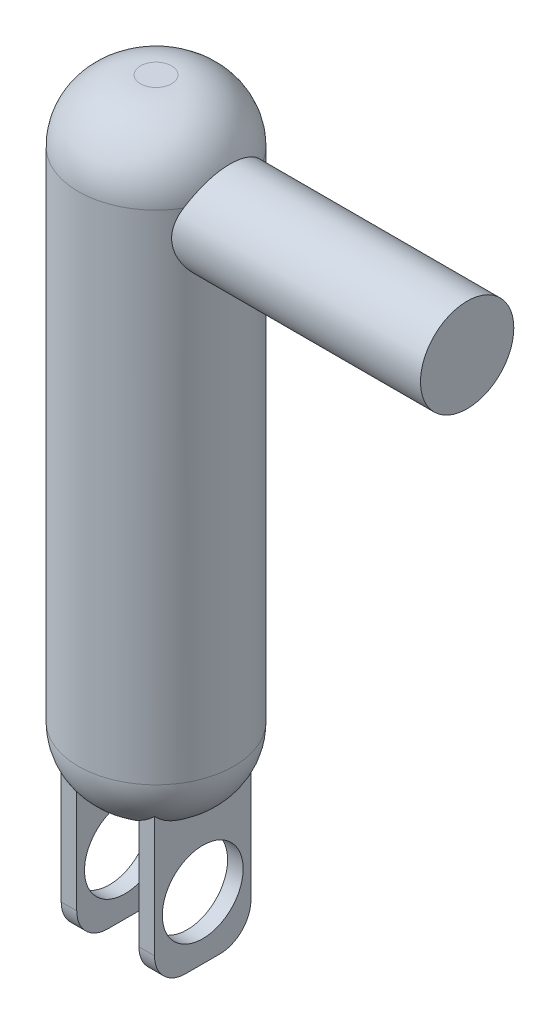
ISO-10303-21;
HEADER;
FILE_DESCRIPTION(('STEP AP214'),'2;1');
FILE_NAME('part.step','',(''),(''),'','','');
FILE_SCHEMA(('AUTOMOTIVE_DESIGN { 1 0 10303 214 1 1 1 1 }'));
ENDSEC;
DATA;
#1=APPLICATION_CONTEXT('core data for automotive mechanical design processes');
#2=APPLICATION_PROTOCOL_DEFINITION('international standard','automotive_design',2000,#1);
#3=PRODUCT_CONTEXT('',#1,'mechanical');
#4=PRODUCT('Part','Part','',(#3));
#5=PRODUCT_RELATED_PRODUCT_CATEGORY('part','',(#4));
#6=PRODUCT_DEFINITION_FORMATION('','',#4);
#7=PRODUCT_DEFINITION_CONTEXT('part definition',#1,'design');
#8=PRODUCT_DEFINITION('design','',#6,#7);
#9=PRODUCT_DEFINITION_SHAPE('','',#8);
#10=(LENGTH_UNIT() NAMED_UNIT(*) SI_UNIT(.MILLI.,.METRE.));
#11=(NAMED_UNIT(*) PLANE_ANGLE_UNIT() SI_UNIT($,.RADIAN.));
#12=(NAMED_UNIT(*) SI_UNIT($,.STERADIAN.) SOLID_ANGLE_UNIT());
#13=UNCERTAINTY_MEASURE_WITH_UNIT(LENGTH_MEASURE(1.E-05),#10,'distance_accuracy_value','');
#14=(GEOMETRIC_REPRESENTATION_CONTEXT(3) GLOBAL_UNCERTAINTY_ASSIGNED_CONTEXT((#13)) GLOBAL_UNIT_ASSIGNED_CONTEXT((#10,
#11,#12)) REPRESENTATION_CONTEXT('',''));
#15=CARTESIAN_POINT('',(0.,0.,0.));
#16=DIRECTION('',(0.,0.,1.));
#17=DIRECTION('',(1.,0.,0.));
#18=AXIS2_PLACEMENT_3D('',#15,#16,#17);
#19=CARTESIAN_POINT('',(0.,-4.,0.));
#20=DIRECTION('',(0.,1.,0.));
#21=DIRECTION('',(0.,0.,1.));
#22=AXIS2_PLACEMENT_3D('',#19,#20,#21);
#23=PLANE('',#22);
#24=DIRECTION('',(0.,0.,-1.));
#25=VECTOR('',#24,1.);
#26=CARTESIAN_POINT('',(-1.5,-4.,1.54960128164039));
#27=LINE('',#26,#25);
#28=CARTESIAN_POINT('',(-1.5,-4.,0.549601281640391));
#29=VERTEX_POINT('',#28);
#30=CARTESIAN_POINT('',(-1.5,-4.,-0.549601281640391));
#31=VERTEX_POINT('',#30);
#32=EDGE_CURVE('E121',#29,#31,#27,.T.);
#33=ORIENTED_EDGE('',*,*,#32,.T.);
#34=DIRECTION('',(1.,0.,0.));
#35=VECTOR('',#34,1.);
#36=CARTESIAN_POINT('',(0.,-4.,-0.549601281640391));
#37=LINE('',#36,#35);
#38=CARTESIAN_POINT('',(-1.,-4.,-0.549601281640391));
#39=VERTEX_POINT('',#38);
#40=EDGE_CURVE('E220',#31,#39,#37,.T.);
#41=ORIENTED_EDGE('',*,*,#40,.T.);
#42=DIRECTION('',(0.,0.,-1.));
#43=VECTOR('',#42,1.);
#44=CARTESIAN_POINT('',(-1.,-4.,1.04960128164039));
#45=LINE('',#44,#43);
#46=CARTESIAN_POINT('',(-1.,-4.,0.549601281640391));
#47=VERTEX_POINT('',#46);
#48=EDGE_CURVE('E384',#47,#39,#45,.T.);
#49=ORIENTED_EDGE('',*,*,#48,.F.);
#50=DIRECTION('',(-1.,0.,0.));
#51=VECTOR('',#50,1.);
#52=CARTESIAN_POINT('',(0.,-4.,0.549601281640391));
#53=LINE('',#52,#51);
#54=EDGE_CURVE('E224',#47,#29,#53,.T.);
#55=ORIENTED_EDGE('',*,*,#54,.T.);
#56=EDGE_LOOP('',(#33,#41,#49,#55));
#57=FACE_BOUND('',#56,.T.);
#58=ADVANCED_FACE('F42',(#57),#23,.F.);
#59=CARTESIAN_POINT('',(1.5,-4.,-1.54960128164039));
#60=DIRECTION('',(0.,0.,1.));
#61=DIRECTION('',(1.,0.,0.));
#62=AXIS2_PLACEMENT_3D('',#59,#60,#61);
#63=PLANE('',#62);
#64=DIRECTION('',(0.,-1.,0.));
#65=VECTOR('',#64,1.);
#66=CARTESIAN_POINT('',(-1.,-4.,-1.54960128164039));
#67=LINE('',#66,#65);
#68=CARTESIAN_POINT('',(-1.,0.519126098050792,-1.54960128164039));
#69=VERTEX_POINT('',#68);
#70=CARTESIAN_POINT('',(-1.,-3.,-1.54960128164039));
#71=VERTEX_POINT('',#70);
#72=EDGE_CURVE('E181',#69,#71,#67,.T.);
#73=ORIENTED_EDGE('',*,*,#72,.T.);
#74=DIRECTION('',(1.,0.,0.));
#75=VECTOR('',#74,1.);
#76=CARTESIAN_POINT('',(1.5,-3.,-1.54960128164039));
#77=LINE('',#76,#75);
#78=CARTESIAN_POINT('',(-1.5,-3.,-1.54960128164039));
#79=VERTEX_POINT('',#78);
#80=EDGE_CURVE('E255',#71,#79,#77,.F.);
#81=ORIENTED_EDGE('',*,*,#80,.T.);
#82=DIRECTION('',(0.,1.,0.));
#83=VECTOR('',#82,1.);
#84=CARTESIAN_POINT('',(-1.5,-4.,-1.54960128164039));
#85=LINE('',#84,#83);
#86=CARTESIAN_POINT('',(-1.5,0.879547043866674,-1.54960128164039));
#87=VERTEX_POINT('',#86);
#88=EDGE_CURVE('E393',#79,#87,#85,.T.);
#89=ORIENTED_EDGE('',*,*,#88,.T.);
#90=CARTESIAN_POINT('',(-1.5,0.879547043866674,-1.54960128164039));
#91=CARTESIAN_POINT('',(-1.4638808582443,0.842390503172263,-1.54960128164039));
#92=CARTESIAN_POINT('',(-1.42606648884728,0.806900844992077,-1.54960128164039));
#93=CARTESIAN_POINT('',(-1.34773043366033,0.739650750616816,-1.54960128164039));
#94=CARTESIAN_POINT('',(-1.30723044033096,0.707865067196324,-1.54960128164039));
#95=CARTESIAN_POINT('',(-1.22367967102287,0.647881223598541,-1.54960128164039));
#96=CARTESIAN_POINT('',(-1.1806295372897,0.619682165722839,-1.54960128164039));
#97=CARTESIAN_POINT('',(-1.09203210493764,0.566722867871002,-1.54960128164039));
#98=CARTESIAN_POINT('',(-1.04646882271296,0.541989333895669,-1.54960128164039));
#99=CARTESIAN_POINT('',(-1.,0.519126098050791,-1.54960128164039));
#100=B_SPLINE_CURVE_WITH_KNOTS('',3,(#90,#91,#92,#93,#94,#95,#96,#97,#98,#99),.UNSPECIFIED.,.F.,
.F.,(4,2,2,2,4),(0.,0.155383386332783,0.309636578684485,0.463851086627952,0.61919536083452),.UNSPECIFIED.);
#101=EDGE_CURVE('E129',#87,#69,#100,.T.);
#102=ORIENTED_EDGE('',*,*,#101,.T.);
#103=EDGE_LOOP('',(#73,#81,#89,#102));
#104=FACE_BOUND('',#103,.T.);
#105=ADVANCED_FACE('F160',(#104),#63,.F.);
#106=CARTESIAN_POINT('',(1.5,-4.,1.54960128164039));
#107=DIRECTION('',(0.,0.,-1.));
#108=DIRECTION('',(-1.,0.,0.));
#109=AXIS2_PLACEMENT_3D('',#106,#107,#108);
#110=PLANE('',#109);
#111=DIRECTION('',(0.,1.,0.));
#112=VECTOR('',#111,1.);
#113=CARTESIAN_POINT('',(-1.5,-4.,1.54960128164039));
#114=LINE('',#113,#112);
#115=CARTESIAN_POINT('',(-1.5,-3.,1.54960128164039));
#116=VERTEX_POINT('',#115);
#117=CARTESIAN_POINT('',(-1.5,0.879547043866674,1.54960128164039));
#118=VERTEX_POINT('',#117);
#119=EDGE_CURVE('E110',#116,#118,#114,.T.);
#120=ORIENTED_EDGE('',*,*,#119,.F.);
#121=DIRECTION('',(-1.,0.,0.));
#122=VECTOR('',#121,1.);
#123=CARTESIAN_POINT('',(1.5,-3.,1.54960128164039));
#124=LINE('',#123,#122);
#125=CARTESIAN_POINT('',(-1.,-3.,1.54960128164039));
#126=VERTEX_POINT('',#125);
#127=EDGE_CURVE('E290',#116,#126,#124,.F.);
#128=ORIENTED_EDGE('',*,*,#127,.T.);
#129=DIRECTION('',(0.,1.,0.));
#130=VECTOR('',#129,1.);
#131=CARTESIAN_POINT('',(-1.,-4.,1.54960128164039));
#132=LINE('',#131,#130);
#133=CARTESIAN_POINT('',(-1.,0.519126098050792,1.54960128164039));
#134=VERTEX_POINT('',#133);
#135=EDGE_CURVE('E374',#126,#134,#132,.T.);
#136=ORIENTED_EDGE('',*,*,#135,.T.);
#137=CARTESIAN_POINT('',(-1.,0.519126098050792,1.54960128164039));
#138=CARTESIAN_POINT('',(-1.04042658820715,0.53902605194962,1.54960128164039));
#139=CARTESIAN_POINT('',(-1.08014913363178,0.560317558514565,1.54960128164039));
#140=CARTESIAN_POINT('',(-1.15799718747282,0.60571175048767,1.54960128164039));
#141=CARTESIAN_POINT('',(-1.19612132461254,0.62981678516088,1.54960128164039));
#142=CARTESIAN_POINT('',(-1.3066719118082,0.705627611504845,1.54960128164039));
#143=CARTESIAN_POINT('',(-1.37641921861021,0.761386360676856,1.54960128164039));
#144=CARTESIAN_POINT('',(-1.46139594686397,0.840786061158543,1.54960128164039));
#145=CARTESIAN_POINT('',(-1.48094055162411,0.859939105412498,1.54960128164039));
#146=CARTESIAN_POINT('',(-1.50000000000001,0.879547043866665,1.54960128164039));
#147=B_SPLINE_CURVE_WITH_KNOTS('',3,(#137,#138,#139,#140,#141,#142,#143,#144,#145,#146),
.UNSPECIFIED.,.F.,.F.,(4,2,2,2,4),(0.,0.135111250664872,0.270336135865954,0.537006119326535,
0.619066123124216),.UNSPECIFIED.);
#148=EDGE_CURVE('E122',#134,#118,#147,.T.);
#149=ORIENTED_EDGE('',*,*,#148,.T.);
#150=EDGE_LOOP('',(#120,#128,#136,#149));
#151=FACE_BOUND('',#150,.T.);
#152=ADVANCED_FACE('F210',(#151),#110,.F.);
#153=CARTESIAN_POINT('',(0.,20.,0.));
#154=DIRECTION('',(0.,-1.,0.));
#155=DIRECTION('',(0.,0.,-1.));
#156=AXIS2_PLACEMENT_3D('',#153,#154,#155);
#157=CYLINDRICAL_SURFACE('',#156,2.5);
#158=CARTESIAN_POINT('',(0.,2.,0.));
#159=DIRECTION('',(0.,1.,0.));
#160=DIRECTION('',(0.,0.,1.));
#161=AXIS2_PLACEMENT_3D('',#158,#159,#160);
#162=CIRCLE('',#161,2.5);
#163=CARTESIAN_POINT('',(0.,2.,2.5));
#164=VERTEX_POINT('',#163);
#165=EDGE_CURVE('E59',#164,#164,#162,.T.);
#166=ORIENTED_EDGE('',*,*,#165,.T.);
#167=EDGE_LOOP('',(#166));
#168=FACE_BOUND('',#167,.T.);
#169=CARTESIAN_POINT('',(2.,17.2021054669246,1.5));
#170=CARTESIAN_POINT('',(1.99999416642511,17.1266264916349,1.50000404108592));
#171=CARTESIAN_POINT('',(2.00433633903481,17.0511670328448,1.49426852824014));
#172=CARTESIAN_POINT('',(2.02092590613883,16.9027815629623,1.47174965152787));
#173=CARTESIAN_POINT('',(2.03318155043097,16.8298582795395,1.45495475788936));
#174=CARTESIAN_POINT('',(2.0636233903473,16.6890218252473,1.41143486335795));
#175=CARTESIAN_POINT('',(2.08176666183119,16.6210766288893,1.3847815450315));
#176=CARTESIAN_POINT('',(2.12185904995836,16.4906680135566,1.32252909283019));
#177=CARTESIAN_POINT('',(2.14380930122416,16.4282062372294,1.28692729054693));
#178=CARTESIAN_POINT('',(2.19228594587542,16.3021564502605,1.20271292747644));
#179=CARTESIAN_POINT('',(2.21904371037662,16.2393645098006,1.15304179435289));
#180=CARTESIAN_POINT('',(2.27226229431061,16.1223407041828,1.04426801309985));
#181=CARTESIAN_POINT('',(2.29872287517103,16.0681153152537,0.985158296729612));
#182=CARTESIAN_POINT('',(2.35175567858734,15.9639716572149,0.851442367411701));
#183=CARTESIAN_POINT('',(2.37803133577818,15.9151510032548,0.775851995162547));
#184=CARTESIAN_POINT('',(2.42443786983179,15.8312957444801,0.615654228271658));
#185=CARTESIAN_POINT('',(2.44457437988735,15.7962484928018,0.531055196626331));
#186=CARTESIAN_POINT('',(2.4747098780044,15.7445095441119,0.363771406742667));
#187=CARTESIAN_POINT('',(2.4854930393917,15.7263851059573,0.281674698130916));
#188=CARTESIAN_POINT('',(2.49874939277545,15.7041626640614,0.114970509382709));
#189=CARTESIAN_POINT('',(2.50123038813308,15.7000514889245,0.0303654624001537));
#190=CARTESIAN_POINT('',(2.49783372711539,15.705719214267,-0.127637283737309));
#191=CARTESIAN_POINT('',(2.49295437513726,15.7138389930939,-0.201123832865634));
#192=CARTESIAN_POINT('',(2.47707997553857,15.7405852625727,-0.345464269151767));
#193=CARTESIAN_POINT('',(2.46608447529309,15.7592125308317,-0.416317961051201));
#194=CARTESIAN_POINT('',(2.43884907201719,15.8062710296283,-0.55405678046908));
#195=CARTESIAN_POINT('',(2.42257910450824,15.8347585280635,-0.620916491037618));
#196=CARTESIAN_POINT('',(2.38609637638748,15.9004900831501,-0.748988660115611));
#197=CARTESIAN_POINT('',(2.36588259201812,15.9377364139836,-0.810199646208011));
#198=CARTESIAN_POINT('',(2.32037925976363,16.024944559729,-0.933074267143199));
#199=CARTESIAN_POINT('',(2.2947718295215,16.0758937786603,-0.993918663198193));
#200=CARTESIAN_POINT('',(2.24255554245601,16.1865095847847,-1.10671465909275));
#201=CARTESIAN_POINT('',(2.21594536703375,16.2461879703991,-1.1586540130834));
#202=CARTESIAN_POINT('',(2.16111075123946,16.3807588730881,-1.25824837767417));
#203=CARTESIAN_POINT('',(2.13305661385124,16.456613043464,-1.30470933188632));
#204=CARTESIAN_POINT('',(2.08250879557267,16.6168116985612,-1.38397217194232));
#205=CARTESIAN_POINT('',(2.06000490298821,16.7011401830502,-1.41679921962189));
#206=CARTESIAN_POINT('',(2.02895865196731,16.8544990988199,-1.46077497064842));
#207=CARTESIAN_POINT('',(2.01833888618316,16.9221460992212,-1.47527903312665));
#208=CARTESIAN_POINT('',(2.00392150777558,17.059479077224,-1.49480872755284));
#209=CARTESIAN_POINT('',(2.00011596115116,17.1291625874091,-1.49984538302907));
#210=CARTESIAN_POINT('',(1.99988914321323,17.2686571493603,-1.50014781114183));
#211=CARTESIAN_POINT('',(2.00347810223984,17.3384682441398,-1.49540004697659));
#212=CARTESIAN_POINT('',(2.01751520788652,17.4760928106731,-1.47640290574941));
#213=CARTESIAN_POINT('',(2.02796877613213,17.5439046591648,-1.4621460183014));
#214=CARTESIAN_POINT('',(2.054317683331,17.6758200464043,-1.42488312618657));
#215=CARTESIAN_POINT('',(2.07020622092812,17.7399281034568,-1.40188805257362));
#216=CARTESIAN_POINT('',(2.10571539417587,17.8635831826547,-1.34796261057072));
#217=CARTESIAN_POINT('',(2.12533743689999,17.9231284732906,-1.31702924888212));
#218=CARTESIAN_POINT('',(2.17036819177737,18.0473455494368,-1.24167439558512));
#219=CARTESIAN_POINT('',(2.19618239397369,18.1110063020211,-1.19582663060303));
#220=CARTESIAN_POINT('',(2.2482175480362,18.230390951774,-1.09487395518701));
#221=CARTESIAN_POINT('',(2.27443886711455,18.2861071590937,-1.03976018672402));
#222=CARTESIAN_POINT('',(2.32835625910913,18.395329474275,-0.91327483721277));
#223=CARTESIAN_POINT('',(2.3558007587587,18.4476061935304,-0.840721108780194));
#224=CARTESIAN_POINT('',(2.40537639133459,18.5390082437612,-0.686103100868022));
#225=CARTESIAN_POINT('',(2.4275110444941,18.5781422947655,-0.604045176134705));
#226=CARTESIAN_POINT('',(2.46252280092775,18.6389736703559,-0.438840232972142));
#227=CARTESIAN_POINT('',(2.47595588067329,18.6617316947157,-0.356205963651261));
#228=CARTESIAN_POINT('',(2.494407389061,18.6928200697708,-0.18738306389086));
#229=CARTESIAN_POINT('',(2.49943534582737,18.7011667576422,-0.101198571781971));
#230=CARTESIAN_POINT('',(2.50040600461976,18.7027800755105,0.0598120232009819));
#231=CARTESIAN_POINT('',(2.49747057186327,18.6979088014876,0.134620583589704));
#232=CARTESIAN_POINT('',(2.48512948412095,18.6772116425429,0.282148755978771));
#233=CARTESIAN_POINT('',(2.47572375706639,18.661385635603,0.354868344701912));
#234=CARTESIAN_POINT('',(2.45149427526962,18.6198858953408,0.495145481978795));
#235=CARTESIAN_POINT('',(2.43675966858906,18.5943738707953,0.562767032608828));
#236=CARTESIAN_POINT('',(2.40303337447155,18.5344648723698,0.692781971999982));
#237=CARTESIAN_POINT('',(2.38404073252268,18.500065906065,0.75517418419983));
#238=CARTESIAN_POINT('',(2.34093432659381,18.4191802703558,0.880263645295945));
#239=CARTESIAN_POINT('',(2.31648844639149,18.3717867579077,0.942258690439938));
#240=CARTESIAN_POINT('',(2.26601907350661,18.2683524332068,1.05789751536306));
#241=CARTESIAN_POINT('',(2.23999385274509,18.2123020413166,1.11153190956915));
#242=CARTESIAN_POINT('',(2.18528165666205,18.0848199047469,1.2159097535057));
#243=CARTESIAN_POINT('',(2.15667566270901,18.0123389807591,1.26542406663367));
#244=CARTESIAN_POINT('',(2.10376464485145,17.858620614158,1.35156817210325));
#245=CARTESIAN_POINT('',(2.07945738811052,17.7773877529431,1.38820466322661));
#246=CARTESIAN_POINT('',(2.0408000304796,17.6150411817874,1.44437116535132));
#247=CARTESIAN_POINT('',(2.02577665830138,17.5345102309633,1.46509526060187));
#248=CARTESIAN_POINT('',(2.00539032320036,17.3700080722209,1.49289268240426));
#249=CARTESIAN_POINT('',(2.00000648744643,17.2860447011658,1.49999550595837));
#250=CARTESIAN_POINT('',(2.,17.2021054669246,1.5));
#251=B_SPLINE_CURVE_WITH_KNOTS('',3,(#169,#170,#171,#172,#173,#174,#175,#176,#177,#178,#179,
#180,#181,#182,#183,#184,#185,#186,#187,#188,#189,#190,#191,#192,#193,#194,#195,#196,#197,#198,
#199,#200,#201,#202,#203,#204,#205,#206,#207,#208,#209,#210,#211,#212,#213,#214,#215,#216,#217,
#218,#219,#220,#221,#222,#223,#224,#225,#226,#227,#228,#229,#230,#231,#232,#233,#234,#235,#236,
#237,#238,#239,#240,#241,#242,#243,#244,#245,#246,#247,#248,#249,#250),.UNSPECIFIED.,.T.,.F.,(4,
2,2,2,2,2,2,2,2,2,2,2,2,2,2,2,2,2,2,2,2,2,2,2,2,2,2,2,2,2,2,2,2,2,2,2,2,2,2,2,4),(0.,
0.226085249493394,0.452406574330771,0.677113624991876,0.90188776221593,1.15414462390001,
1.40659128601844,1.68630157736223,1.9657544327122,2.21853330858497,2.47107452602767,
2.69230130543182,2.91354445887944,3.13607155036377,3.35865648368878,3.60782810055849,
3.85733966656908,4.13576671140276,4.41367760154768,4.62276298054683,4.83160475643976,
5.04073566011181,5.25003193304127,5.45906724365495,5.66818149154661,5.91499438482002,
6.16204457978454,6.44121828011588,6.72020638384847,6.97891479383337,7.23732973022726,
7.46129321849399,7.68525920139648,7.90563970188756,8.12606965394584,8.37042963549487,
8.61506198741955,8.89071695766603,9.16622832484805,9.41820120134353,9.66962780912277),.UNSPECIFIED.);
#252=CARTESIAN_POINT('',(2.15328485944422,18.,1.2701827876681));
#253=VERTEX_POINT('',#252);
#254=CARTESIAN_POINT('',(2.15328485944421,18.,-1.2701827876681));
#255=VERTEX_POINT('',#254);
#256=EDGE_CURVE('E249',#253,#255,#251,.T.);
#257=ORIENTED_EDGE('',*,*,#256,.F.);
#258=CARTESIAN_POINT('',(0.,18.,0.));
#259=DIRECTION('',(0.,1.,0.));
#260=DIRECTION('',(0.,0.,1.));
#261=AXIS2_PLACEMENT_3D('',#258,#259,#260);
#262=CIRCLE('',#261,2.5);
#263=EDGE_CURVE('E300',#253,#255,#262,.F.);
#264=ORIENTED_EDGE('',*,*,#263,.T.);
#265=EDGE_LOOP('',(#257,#264));
#266=FACE_BOUND('',#265,.T.);
#267=ADVANCED_FACE('F333',(#168,#266),#157,.T.);
#268=CARTESIAN_POINT('',(0.,20.,0.));
#269=DIRECTION('',(0.,1.,0.));
#270=DIRECTION('',(0.,0.,1.));
#271=AXIS2_PLACEMENT_3D('',#268,#269,#270);
#272=PLANE('',#271);
#273=CARTESIAN_POINT('',(0.,20.,0.));
#274=DIRECTION('',(0.,1.,0.));
#275=DIRECTION('',(0.,0.,1.));
#276=AXIS2_PLACEMENT_3D('',#273,#274,#275);
#277=CIRCLE('',#276,0.5);
#278=CARTESIAN_POINT('',(0.,20.,0.5));
#279=VERTEX_POINT('',#278);
#280=EDGE_CURVE('E296',#279,#279,#277,.T.);
#281=ORIENTED_EDGE('',*,*,#280,.T.);
#282=EDGE_LOOP('',(#281));
#283=FACE_BOUND('',#282,.T.);
#284=ADVANCED_FACE('F337',(#283),#272,.T.);
#285=CARTESIAN_POINT('',(10.,17.2021054669246,0.));
#286=DIRECTION('',(-1.,0.,0.));
#287=DIRECTION('',(0.,0.,1.));
#288=AXIS2_PLACEMENT_3D('',#285,#286,#287);
#289=CYLINDRICAL_SURFACE('',#288,1.5);
#290=CARTESIAN_POINT('',(10.,17.2021054669246,0.));
#291=DIRECTION('',(1.,0.,0.));
#292=DIRECTION('',(0.,0.,-1.));
#293=AXIS2_PLACEMENT_3D('',#290,#291,#292);
#294=CIRCLE('',#293,1.5);
#295=CARTESIAN_POINT('',(10.,17.2021054669246,-1.5));
#296=VERTEX_POINT('',#295);
#297=EDGE_CURVE('E346',#296,#296,#294,.T.);
#298=ORIENTED_EDGE('',*,*,#297,.F.);
#299=EDGE_LOOP('',(#298));
#300=FACE_BOUND('',#299,.T.);
#301=ORIENTED_EDGE('',*,*,#256,.T.);
#302=CARTESIAN_POINT('',(2.15328485944422,18.,-1.2701827876681));
#303=CARTESIAN_POINT('',(2.16587392853873,18.0339743995266,-1.24884206186948));
#304=CARTESIAN_POINT('',(2.17788511895782,18.0672295514444,-1.22604844473808));
#305=CARTESIAN_POINT('',(2.20076898473468,18.1320457970103,-1.17764532690626));
#306=CARTESIAN_POINT('',(2.21164150031463,18.1636066526141,-1.15203543205912));
#307=CARTESIAN_POINT('',(2.24255496762565,18.2553001849948,-1.0711700052839));
#308=CARTESIAN_POINT('',(2.26091241490787,18.3125003455137,-1.01184345505136));
#309=CARTESIAN_POINT('',(2.2932448745679,18.4168994059381,-0.883808676348255));
#310=CARTESIAN_POINT('',(2.3072135263068,18.4640837582191,-0.815087036637778));
#311=CARTESIAN_POINT('',(2.3309624503762,18.5466147240595,-0.670248840470271));
#312=CARTESIAN_POINT('',(2.3407452220103,18.5819683987193,-0.594136730117599));
#313=CARTESIAN_POINT('',(2.35622187942468,18.6389776011218,-0.438339111543537));
#314=CARTESIAN_POINT('',(2.36199514086901,18.6608979698501,-0.358758236264733));
#315=CARTESIAN_POINT('',(2.36996861653687,18.6914076007743,-0.196883746024653));
#316=CARTESIAN_POINT('',(2.37216797961963,18.6999936873263,-0.11458948961856));
#317=CARTESIAN_POINT('',(2.37307367839003,18.7035133944851,0.0496041482345367));
#318=CARTESIAN_POINT('',(2.37180963599937,18.6985627928392,0.131500914123435));
#319=CARTESIAN_POINT('',(2.36580215584262,18.6754262234782,0.29325565315652));
#320=CARTESIAN_POINT('',(2.36105942754551,18.6572429545372,0.373114038587071));
#321=CARTESIAN_POINT('',(2.34793334601786,18.6082785977509,0.528496491007332));
#322=CARTESIAN_POINT('',(2.33955228859481,18.5775054548953,0.604023257306609));
#323=CARTESIAN_POINT('',(2.31891938779767,18.5044064252262,0.748721227858316));
#324=CARTESIAN_POINT('',(2.30666604616792,18.4620760675845,0.817889958679176));
#325=CARTESIAN_POINT('',(2.27798387832748,18.3670503057562,0.948401476122985));
#326=CARTESIAN_POINT('',(2.26152883176304,18.3142903012027,1.00969134539593));
#327=CARTESIAN_POINT('',(2.22433631553016,18.2004927647196,1.12232303857755));
#328=CARTESIAN_POINT('',(2.20360603926153,18.1394691953374,1.17368129549456));
#329=CARTESIAN_POINT('',(2.17189504376882,18.0506976033489,1.23726598405763));
#330=CARTESIAN_POINT('',(2.16275045066445,18.0255429304402,1.25414664038339));
#331=CARTESIAN_POINT('',(2.15328485944425,18.,1.27018278766813));
#332=B_SPLINE_CURVE_WITH_KNOTS('',3,(#302,#303,#304,#305,#306,#307,#308,#309,#310,#311,#312,
#313,#314,#315,#316,#317,#318,#319,#320,#321,#322,#323,#324,#325,#326,#327,#328,#329,#330,#331),
.UNSPECIFIED.,.F.,.F.,(4,2,2,2,2,2,2,2,2,2,2,2,2,2,4),(0.,0.126078385386652,0.252174438341399,
0.504159961826132,0.756509018642805,1.00870719201915,1.25575822663245,1.50286808899824,
1.7478710749629,1.99282410709121,2.23762279654875,2.48251631918161,2.72897710851837,
2.97502654348348,3.06989011355459),.UNSPECIFIED.);
#333=EDGE_CURVE('E67',#255,#253,#332,.T.);
#334=ORIENTED_EDGE('',*,*,#333,.T.);
#335=EDGE_LOOP('',(#301,#334));
#336=FACE_BOUND('',#335,.T.);
#337=ADVANCED_FACE('F201',(#300,#336),#289,.T.);
#338=CARTESIAN_POINT('',(10.,17.2021054669246,0.));
#339=DIRECTION('',(1.,0.,0.));
#340=DIRECTION('',(0.,0.,-1.));
#341=AXIS2_PLACEMENT_3D('',#338,#339,#340);
#342=PLANE('',#341);
#343=ORIENTED_EDGE('',*,*,#297,.T.);
#344=EDGE_LOOP('',(#343));
#345=FACE_BOUND('',#344,.T.);
#346=ADVANCED_FACE('F192',(#345),#342,.T.);
#347=DIRECTION('',(0.,0.,1.));
#348=VECTOR('',#347,1.);
#349=CARTESIAN_POINT('',(1.,-4.,1.04960128164039));
#350=LINE('',#349,#348);
#351=CARTESIAN_POINT('',(1.,-4.,-0.549601281640391));
#352=VERTEX_POINT('',#351);
#353=CARTESIAN_POINT('',(1.,-4.,0.549601281640391));
#354=VERTEX_POINT('',#353);
#355=EDGE_CURVE('E380',#352,#354,#350,.T.);
#356=ORIENTED_EDGE('',*,*,#355,.F.);
#357=DIRECTION('',(1.,0.,0.));
#358=VECTOR('',#357,1.);
#359=CARTESIAN_POINT('',(0.,-4.,-0.549601281640391));
#360=LINE('',#359,#358);
#361=CARTESIAN_POINT('',(1.5,-4.,-0.549601281640391));
#362=VERTEX_POINT('',#361);
#363=EDGE_CURVE('E268',#352,#362,#360,.T.);
#364=ORIENTED_EDGE('',*,*,#363,.T.);
#365=DIRECTION('',(0.,0.,1.));
#366=VECTOR('',#365,1.);
#367=CARTESIAN_POINT('',(1.5,-4.,1.54960128164039));
#368=LINE('',#367,#366);
#369=CARTESIAN_POINT('',(1.5,-4.,0.549601281640391));
#370=VERTEX_POINT('',#369);
#371=EDGE_CURVE('E231',#362,#370,#368,.T.);
#372=ORIENTED_EDGE('',*,*,#371,.T.);
#373=DIRECTION('',(-1.,0.,0.));
#374=VECTOR('',#373,1.);
#375=CARTESIAN_POINT('',(0.,-4.,0.549601281640391));
#376=LINE('',#375,#374);
#377=EDGE_CURVE('E264',#370,#354,#376,.T.);
#378=ORIENTED_EDGE('',*,*,#377,.T.);
#379=EDGE_LOOP('',(#356,#364,#372,#378));
#380=FACE_BOUND('',#379,.T.);
#381=ADVANCED_FACE('F190',(#380),#23,.F.);
#382=CARTESIAN_POINT('',(-1.5,-4.,1.54960128164039));
#383=DIRECTION('',(1.,0.,0.));
#384=DIRECTION('',(0.,0.,-1.));
#385=AXIS2_PLACEMENT_3D('',#382,#383,#384);
#386=PLANE('',#385);
#387=CARTESIAN_POINT('',(-1.5,-2.,0.));
#388=DIRECTION('',(1.,0.,0.));
#389=DIRECTION('',(0.,0.,-1.));
#390=AXIS2_PLACEMENT_3D('',#387,#388,#389);
#391=CIRCLE('',#390,1.3);
#392=CARTESIAN_POINT('',(-1.5,-2.,-1.3));
#393=VERTEX_POINT('',#392);
#394=EDGE_CURVE('E358',#393,#393,#391,.T.);
#395=ORIENTED_EDGE('',*,*,#394,.T.);
#396=EDGE_LOOP('',(#395));
#397=FACE_BOUND('',#396,.T.);
#398=ORIENTED_EDGE('',*,*,#88,.F.);
#399=CARTESIAN_POINT('',(-1.5,-3.,-0.549601281640391));
#400=DIRECTION('',(1.,0.,0.));
#401=DIRECTION('',(0.,0.,-1.));
#402=AXIS2_PLACEMENT_3D('',#399,#400,#401);
#403=CIRCLE('',#402,1.);
#404=EDGE_CURVE('E239',#79,#31,#403,.F.);
#405=ORIENTED_EDGE('',*,*,#404,.T.);
#406=ORIENTED_EDGE('',*,*,#32,.F.);
#407=CARTESIAN_POINT('',(-1.5,-3.,0.549601281640391));
#408=DIRECTION('',(1.,0.,0.));
#409=DIRECTION('',(0.,0.,-1.));
#410=AXIS2_PLACEMENT_3D('',#407,#408,#409);
#411=CIRCLE('',#410,1.);
#412=EDGE_CURVE('E259',#29,#116,#411,.F.);
#413=ORIENTED_EDGE('',*,*,#412,.T.);
#414=ORIENTED_EDGE('',*,*,#119,.T.);
#415=CARTESIAN_POINT('',(-1.5,0.879547043866674,1.54960128164039));
#416=CARTESIAN_POINT('',(-1.5,0.836239588061282,1.50885744664976));
#417=CARTESIAN_POINT('',(-1.5,0.795075788569308,1.46587094433178));
#418=CARTESIAN_POINT('',(-1.5,0.717296406675583,1.37603636151976));
#419=CARTESIAN_POINT('',(-1.5,0.680676187610209,1.32919230022427));
#420=CARTESIAN_POINT('',(-1.5,0.61250317328172,1.23267329450241));
#421=CARTESIAN_POINT('',(-1.5,0.580902641998873,1.18303197460386));
#422=CARTESIAN_POINT('',(-1.5,0.522405131644747,1.08106176445053));
#423=CARTESIAN_POINT('',(-1.5,0.495508773207934,1.02873252074699));
#424=CARTESIAN_POINT('',(-1.5,0.428024139887369,0.881883893575774));
#425=CARTESIAN_POINT('',(-1.5,0.392262239157324,0.785110968316747));
#426=CARTESIAN_POINT('',(-1.5,0.334470875502265,0.587428488850702));
#427=CARTESIAN_POINT('',(-1.5,0.312473860390673,0.486509753532893));
#428=CARTESIAN_POINT('',(-1.5,0.278175452805566,0.262302323516828));
#429=CARTESIAN_POINT('',(-1.5,0.268698788811999,0.138581963541739));
#430=CARTESIAN_POINT('',(-1.5,0.267283674241392,-0.109022516022136));
#431=CARTESIAN_POINT('',(-1.5,0.275357286971315,-0.232906689717983));
#432=CARTESIAN_POINT('',(-1.5,0.309468771221873,-0.475254543417549));
#433=CARTESIAN_POINT('',(-1.5,0.335077036611678,-0.593777121229033));
#434=CARTESIAN_POINT('',(-1.5,0.405392254936453,-0.824837597010989));
#435=CARTESIAN_POINT('',(-1.5,0.450036149795975,-0.93739388714539));
#436=CARTESIAN_POINT('',(-1.5,0.528290024594065,-1.09160087695914));
#437=CARTESIAN_POINT('',(-1.5,0.553903120881245,-1.13741157428269));
#438=CARTESIAN_POINT('',(-1.5,0.608855777526868,-1.22674453878063));
#439=CARTESIAN_POINT('',(-1.5,0.638194399090997,-1.2702673785785));
#440=CARTESIAN_POINT('',(-1.5,0.700774142380349,-1.35496044749854));
#441=CARTESIAN_POINT('',(-1.5,0.734044897841,-1.39610881096917));
#442=CARTESIAN_POINT('',(-1.5,0.804160173868757,-1.47529870483119));
#443=CARTESIAN_POINT('',(-1.5,0.841007718693157,-1.51333755511451));
#444=CARTESIAN_POINT('',(-1.5,0.879547043866669,-1.54960128164039));
#445=B_SPLINE_CURVE_WITH_KNOTS('',3,(#415,#416,#417,#418,#419,#420,#421,#422,#423,#424,#425,
#426,#427,#428,#429,#430,#431,#432,#433,#434,#435,#436,#437,#438,#439,#440,#441,#442,#443,#444),
.UNSPECIFIED.,.F.,.F.,(4,2,2,2,2,2,2,2,2,2,2,2,2,2,4),(0.,0.178266724217161,0.356350006617044,
0.532622680168899,0.70891859234543,1.01721198125547,1.32622939586268,1.69714588778326,
2.06831741239289,2.43070596275405,2.79190326655837,2.9492111704684,3.10647951276515,
3.26501936070499,3.4236944451077),.UNSPECIFIED.);
#446=EDGE_CURVE('E169',#118,#87,#445,.T.);
#447=ORIENTED_EDGE('',*,*,#446,.T.);
#448=EDGE_LOOP('',(#398,#405,#406,#413,#414,#447));
#449=FACE_BOUND('',#448,.T.);
#450=ADVANCED_FACE('F158',(#397,#449),#386,.F.);
#451=DIRECTION('',(0.,1.,0.));
#452=VECTOR('',#451,1.);
#453=CARTESIAN_POINT('',(1.5,-4.,-1.54960128164039));
#454=LINE('',#453,#452);
#455=CARTESIAN_POINT('',(1.5,-3.,-1.54960128164039));
#456=VERTEX_POINT('',#455);
#457=CARTESIAN_POINT('',(1.5,0.879547043866674,-1.54960128164039));
#458=VERTEX_POINT('',#457);
#459=EDGE_CURVE('E109',#456,#458,#454,.T.);
#460=ORIENTED_EDGE('',*,*,#459,.F.);
#461=DIRECTION('',(1.,0.,0.));
#462=VECTOR('',#461,1.);
#463=CARTESIAN_POINT('',(1.5,-3.,-1.54960128164039));
#464=LINE('',#463,#462);
#465=CARTESIAN_POINT('',(1.,-3.,-1.54960128164039));
#466=VERTEX_POINT('',#465);
#467=EDGE_CURVE('E278',#456,#466,#464,.F.);
#468=ORIENTED_EDGE('',*,*,#467,.T.);
#469=DIRECTION('',(0.,1.,0.));
#470=VECTOR('',#469,1.);
#471=CARTESIAN_POINT('',(1.,-4.,-1.54960128164039));
#472=LINE('',#471,#470);
#473=CARTESIAN_POINT('',(1.,0.519126098050792,-1.54960128164039));
#474=VERTEX_POINT('',#473);
#475=EDGE_CURVE('E371',#466,#474,#472,.T.);
#476=ORIENTED_EDGE('',*,*,#475,.T.);
#477=CARTESIAN_POINT('',(1.,0.519126098050792,-1.54960128164039));
#478=CARTESIAN_POINT('',(1.04042658820715,0.53902605194962,-1.54960128164039));
#479=CARTESIAN_POINT('',(1.08014913363178,0.560317558514565,-1.54960128164039));
#480=CARTESIAN_POINT('',(1.15799718747282,0.60571175048767,-1.54960128164039));
#481=CARTESIAN_POINT('',(1.19612132461254,0.62981678516088,-1.54960128164039));
#482=CARTESIAN_POINT('',(1.3066719118082,0.705627611504845,-1.54960128164039));
#483=CARTESIAN_POINT('',(1.37641921861021,0.761386360676855,-1.54960128164039));
#484=CARTESIAN_POINT('',(1.46139594686397,0.840786061158543,-1.54960128164039));
#485=CARTESIAN_POINT('',(1.48094055162411,0.859939105412498,-1.54960128164039));
#486=CARTESIAN_POINT('',(1.50000000000001,0.879547043866665,-1.54960128164039));
#487=B_SPLINE_CURVE_WITH_KNOTS('',3,(#477,#478,#479,#480,#481,#482,#483,#484,#485,#486),
.UNSPECIFIED.,.F.,.F.,(4,2,2,2,4),(0.,0.135111250664872,0.270336135865953,0.537006119326535,
0.619066123124216),.UNSPECIFIED.);
#488=EDGE_CURVE('E135',#474,#458,#487,.T.);
#489=ORIENTED_EDGE('',*,*,#488,.T.);
#490=EDGE_LOOP('',(#460,#468,#476,#489));
#491=FACE_BOUND('',#490,.T.);
#492=ADVANCED_FACE('F151',(#491),#63,.F.);
#493=CARTESIAN_POINT('',(1.5,-4.,1.54960128164039));
#494=DIRECTION('',(-1.,0.,0.));
#495=DIRECTION('',(0.,0.,1.));
#496=AXIS2_PLACEMENT_3D('',#493,#494,#495);
#497=PLANE('',#496);
#498=CARTESIAN_POINT('',(1.5,-2.,0.));
#499=DIRECTION('',(1.,0.,0.));
#500=DIRECTION('',(0.,0.,-1.));
#501=AXIS2_PLACEMENT_3D('',#498,#499,#500);
#502=CIRCLE('',#501,1.3);
#503=CARTESIAN_POINT('',(1.5,-2.,-1.3));
#504=VERTEX_POINT('',#503);
#505=EDGE_CURVE('E352',#504,#504,#502,.T.);
#506=ORIENTED_EDGE('',*,*,#505,.F.);
#507=EDGE_LOOP('',(#506));
#508=FACE_BOUND('',#507,.T.);
#509=ORIENTED_EDGE('',*,*,#371,.F.);
#510=CARTESIAN_POINT('',(1.5,-3.,-0.549601281640391));
#511=DIRECTION('',(-1.,0.,0.));
#512=DIRECTION('',(0.,0.,1.));
#513=AXIS2_PLACEMENT_3D('',#510,#511,#512);
#514=CIRCLE('',#513,1.);
#515=EDGE_CURVE('E275',#362,#456,#514,.F.);
#516=ORIENTED_EDGE('',*,*,#515,.T.);
#517=ORIENTED_EDGE('',*,*,#459,.T.);
#518=CARTESIAN_POINT('',(1.5,0.879547043866674,-1.54960128164039));
#519=CARTESIAN_POINT('',(1.5,0.836239588061282,-1.50885744664976));
#520=CARTESIAN_POINT('',(1.5,0.795075788569308,-1.46587094433178));
#521=CARTESIAN_POINT('',(1.5,0.717296406675583,-1.37603636151976));
#522=CARTESIAN_POINT('',(1.5,0.680676187610209,-1.32919230022427));
#523=CARTESIAN_POINT('',(1.5,0.61250317328172,-1.23267329450241));
#524=CARTESIAN_POINT('',(1.5,0.580902641998874,-1.18303197460386));
#525=CARTESIAN_POINT('',(1.5,0.522405131644748,-1.08106176445053));
#526=CARTESIAN_POINT('',(1.5,0.495508773207934,-1.02873252074699));
#527=CARTESIAN_POINT('',(1.5,0.428024139887369,-0.881883893575774));
#528=CARTESIAN_POINT('',(1.5,0.392262239157324,-0.785110968316747));
#529=CARTESIAN_POINT('',(1.5,0.334470875502265,-0.587428488850702));
#530=CARTESIAN_POINT('',(1.5,0.312473860390674,-0.486509753532893));
#531=CARTESIAN_POINT('',(1.5,0.278175452805566,-0.262302323516828));
#532=CARTESIAN_POINT('',(1.5,0.268698788811999,-0.138581963541739));
#533=CARTESIAN_POINT('',(1.5,0.267283674241392,0.109022516022136));
#534=CARTESIAN_POINT('',(1.5,0.275357286971315,0.232906689717983));
#535=CARTESIAN_POINT('',(1.5,0.309468771221874,0.475254543417549));
#536=CARTESIAN_POINT('',(1.5,0.335077036611678,0.593777121229033));
#537=CARTESIAN_POINT('',(1.5,0.405392254936454,0.824837597010989));
#538=CARTESIAN_POINT('',(1.5,0.450036149795975,0.93739388714539));
#539=CARTESIAN_POINT('',(1.5,0.528290024594066,1.09160087695914));
#540=CARTESIAN_POINT('',(1.5,0.553903120881246,1.13741157428269));
#541=CARTESIAN_POINT('',(1.5,0.608855777526869,1.22674453878063));
#542=CARTESIAN_POINT('',(1.5,0.638194399090998,1.2702673785785));
#543=CARTESIAN_POINT('',(1.5,0.70077414238035,1.35496044749854));
#544=CARTESIAN_POINT('',(1.5,0.734044897841001,1.39610881096917));
#545=CARTESIAN_POINT('',(1.5,0.804160173868758,1.47529870483119));
#546=CARTESIAN_POINT('',(1.5,0.841007718693157,1.51333755511452));
#547=CARTESIAN_POINT('',(1.5,0.87954704386667,1.54960128164039));
#548=B_SPLINE_CURVE_WITH_KNOTS('',3,(#518,#519,#520,#521,#522,#523,#524,#525,#526,#527,#528,
#529,#530,#531,#532,#533,#534,#535,#536,#537,#538,#539,#540,#541,#542,#543,#544,#545,#546,#547),
.UNSPECIFIED.,.F.,.F.,(4,2,2,2,2,2,2,2,2,2,2,2,2,2,4),(0.,0.178266724217161,0.356350006617045,
0.5326226801689,0.708918592345431,1.01721198125547,1.32622939586268,1.69714588778326,
2.06831741239289,2.43070596275405,2.79190326655837,2.9492111704684,3.10647951276515,
3.26501936070499,3.4236944451077),.UNSPECIFIED.);
#549=CARTESIAN_POINT('',(1.5,0.879547043866674,1.54960128164039));
#550=VERTEX_POINT('',#549);
#551=EDGE_CURVE('E116',#458,#550,#548,.T.);
#552=ORIENTED_EDGE('',*,*,#551,.T.);
#553=DIRECTION('',(0.,1.,0.));
#554=VECTOR('',#553,1.);
#555=CARTESIAN_POINT('',(1.5,-4.,1.54960128164039));
#556=LINE('',#555,#554);
#557=CARTESIAN_POINT('',(1.5,-3.,1.54960128164039));
#558=VERTEX_POINT('',#557);
#559=EDGE_CURVE('E97',#558,#550,#556,.T.);
#560=ORIENTED_EDGE('',*,*,#559,.F.);
#561=CARTESIAN_POINT('',(1.5,-3.,0.549601281640391));
#562=DIRECTION('',(-1.,0.,0.));
#563=DIRECTION('',(0.,0.,1.));
#564=AXIS2_PLACEMENT_3D('',#561,#562,#563);
#565=CIRCLE('',#564,1.);
#566=EDGE_CURVE('E272',#558,#370,#565,.F.);
#567=ORIENTED_EDGE('',*,*,#566,.T.);
#568=EDGE_LOOP('',(#509,#516,#517,#552,#560,#567));
#569=FACE_BOUND('',#568,.T.);
#570=ADVANCED_FACE('F124',(#508,#569),#497,.F.);
#571=DIRECTION('',(0.,-1.,0.));
#572=VECTOR('',#571,1.);
#573=CARTESIAN_POINT('',(1.,-4.,1.54960128164039));
#574=LINE('',#573,#572);
#575=CARTESIAN_POINT('',(1.,0.519126098050792,1.54960128164039));
#576=VERTEX_POINT('',#575);
#577=CARTESIAN_POINT('',(1.,-3.,1.54960128164039));
#578=VERTEX_POINT('',#577);
#579=EDGE_CURVE('E368',#576,#578,#574,.T.);
#580=ORIENTED_EDGE('',*,*,#579,.T.);
#581=DIRECTION('',(-1.,0.,0.));
#582=VECTOR('',#581,1.);
#583=CARTESIAN_POINT('',(1.5,-3.,1.54960128164039));
#584=LINE('',#583,#582);
#585=EDGE_CURVE('E103',#578,#558,#584,.F.);
#586=ORIENTED_EDGE('',*,*,#585,.T.);
#587=ORIENTED_EDGE('',*,*,#559,.T.);
#588=CARTESIAN_POINT('',(1.5,0.879547043866674,1.54960128164039));
#589=CARTESIAN_POINT('',(1.4638808582443,0.842390503172264,1.54960128164039));
#590=CARTESIAN_POINT('',(1.42606648884728,0.806900844992078,1.54960128164039));
#591=CARTESIAN_POINT('',(1.34773043366033,0.739650750616816,1.54960128164039));
#592=CARTESIAN_POINT('',(1.30723044033096,0.707865067196324,1.54960128164039));
#593=CARTESIAN_POINT('',(1.22367967102287,0.647881223598541,1.54960128164039));
#594=CARTESIAN_POINT('',(1.1806295372897,0.619682165722839,1.54960128164039));
#595=CARTESIAN_POINT('',(1.09203210493764,0.566722867871003,1.54960128164039));
#596=CARTESIAN_POINT('',(1.04646882271296,0.54198933389567,1.54960128164039));
#597=CARTESIAN_POINT('',(1.,0.519126098050791,1.54960128164039));
#598=B_SPLINE_CURVE_WITH_KNOTS('',3,(#588,#589,#590,#591,#592,#593,#594,#595,#596,#597),
.UNSPECIFIED.,.F.,.F.,(4,2,2,2,4),(0.,0.155383386332783,0.309636578684486,0.463851086627953,
0.619195360834521),.UNSPECIFIED.);
#599=EDGE_CURVE('E47',#550,#576,#598,.T.);
#600=ORIENTED_EDGE('',*,*,#599,.T.);
#601=EDGE_LOOP('',(#580,#586,#587,#600));
#602=FACE_BOUND('',#601,.T.);
#603=ADVANCED_FACE('F100',(#602),#110,.F.);
#604=CARTESIAN_POINT('',(1.,-4.,1.04960128164039));
#605=DIRECTION('',(-1.,0.,0.));
#606=DIRECTION('',(0.,0.,1.));
#607=AXIS2_PLACEMENT_3D('',#604,#605,#606);
#608=PLANE('',#607);
#609=CARTESIAN_POINT('',(1.,-2.,0.));
#610=DIRECTION('',(-1.,0.,0.));
#611=DIRECTION('',(0.,0.,1.));
#612=AXIS2_PLACEMENT_3D('',#609,#610,#611);
#613=CIRCLE('',#612,1.3);
#614=CARTESIAN_POINT('',(1.,-2.,1.3));
#615=VERTEX_POINT('',#614);
#616=EDGE_CURVE('E351',#615,#615,#613,.T.);
#617=ORIENTED_EDGE('',*,*,#616,.F.);
#618=EDGE_LOOP('',(#617));
#619=FACE_BOUND('',#618,.T.);
#620=ORIENTED_EDGE('',*,*,#475,.F.);
#621=CARTESIAN_POINT('',(1.,-3.,-0.549601281640391));
#622=DIRECTION('',(-1.,0.,0.));
#623=DIRECTION('',(0.,0.,1.));
#624=AXIS2_PLACEMENT_3D('',#621,#622,#623);
#625=CIRCLE('',#624,1.);
#626=EDGE_CURVE('E286',#466,#352,#625,.T.);
#627=ORIENTED_EDGE('',*,*,#626,.T.);
#628=ORIENTED_EDGE('',*,*,#355,.T.);
#629=CARTESIAN_POINT('',(1.,-3.,0.549601281640391));
#630=DIRECTION('',(-1.,0.,0.));
#631=DIRECTION('',(0.,0.,1.));
#632=AXIS2_PLACEMENT_3D('',#629,#630,#631);
#633=CIRCLE('',#632,1.);
#634=EDGE_CURVE('E282',#354,#578,#633,.T.);
#635=ORIENTED_EDGE('',*,*,#634,.T.);
#636=ORIENTED_EDGE('',*,*,#579,.F.);
#637=CARTESIAN_POINT('',(1.,0.519126098050792,-1.54960128164039));
#638=CARTESIAN_POINT('',(1.,0.483888852087644,-1.50342260502705));
#639=CARTESIAN_POINT('',(1.,0.450731939608215,-1.455676053126));
#640=CARTESIAN_POINT('',(1.,0.388696955235137,-1.35753793706022));
#641=CARTESIAN_POINT('',(1.,0.359815020783658,-1.30714881698014));
#642=CARTESIAN_POINT('',(1.,0.306791794866978,-1.20491740201538));
#643=CARTESIAN_POINT('',(1.,0.28258483756675,-1.15310905478566));
#644=CARTESIAN_POINT('',(1.,0.238340583752913,-1.04773576340967));
#645=CARTESIAN_POINT('',(1.,0.218304314019159,-0.994170390450333));
#646=CARTESIAN_POINT('',(1.,0.175935262144797,-0.866541063202906));
#647=CARTESIAN_POINT('',(1.,0.155288080520847,-0.791915208608057));
#648=CARTESIAN_POINT('',(1.,0.120837273926645,-0.641106222220667));
#649=CARTESIAN_POINT('',(1.,0.107036422460017,-0.564922472303773));
#650=CARTESIAN_POINT('',(1.,0.0852895425080045,-0.411002836881657));
#651=CARTESIAN_POINT('',(1.,0.0774009317257691,-0.333259072860284));
#652=CARTESIAN_POINT('',(1.,0.0667542885960305,-0.177430750005136));
#653=CARTESIAN_POINT('',(1.,0.0639969094725154,-0.0993461490496972));
#654=CARTESIAN_POINT('',(1.,0.0631084682169036,0.0619071425573507));
#655=CARTESIAN_POINT('',(1.,0.0652884915007608,0.145077682797591));
#656=CARTESIAN_POINT('',(1.,0.0753544664853755,0.311089333840733));
#657=CARTESIAN_POINT('',(1.,0.0832402961200202,0.39393045165295));
#658=CARTESIAN_POINT('',(1.,0.105739445086442,0.557932580848478));
#659=CARTESIAN_POINT('',(1.,0.120288004276014,0.639102078917527));
#660=CARTESIAN_POINT('',(1.,0.157142617751511,0.799618844256848));
#661=CARTESIAN_POINT('',(1.,0.179443841020753,0.878967213601554));
#662=CARTESIAN_POINT('',(1.,0.241942021488829,1.06233696166134));
#663=CARTESIAN_POINT('',(1.,0.285675266674568,1.16520880928342));
#664=CARTESIAN_POINT('',(1.,0.363598233353394,1.31386620491971));
#665=CARTESIAN_POINT('',(1.,0.391881626682539,1.3628162060586));
#666=CARTESIAN_POINT('',(1.,0.452492238045224,1.45819945265579));
#667=CARTESIAN_POINT('',(1.,0.484822757301602,1.50463059866396));
#668=CARTESIAN_POINT('',(1.,0.519126098050792,1.54960128164039));
#669=B_SPLINE_CURVE_WITH_KNOTS('',3,(#637,#638,#639,#640,#641,#642,#643,#644,#645,#646,#647,
#648,#649,#650,#651,#652,#653,#654,#655,#656,#657,#658,#659,#660,#661,#662,#663,#664,#665,#666,
#667,#668),.UNSPECIFIED.,.F.,.F.,(4,2,2,2,2,2,2,2,2,2,2,2,2,2,2,4),(0.,0.174181598611834,
0.34820484597382,0.519570275719189,0.690977844082398,0.922886061357152,1.15488814995963,
1.38911516561048,1.62337199715183,1.87279559091727,2.12221384884294,2.36925765422271,
2.61614779117104,2.94996581233421,3.11939098537872,3.28895526949893),.UNSPECIFIED.);
#670=EDGE_CURVE('E118',#474,#576,#669,.T.);
#671=ORIENTED_EDGE('',*,*,#670,.F.);
#672=EDGE_LOOP('',(#620,#627,#628,#635,#636,#671));
#673=FACE_BOUND('',#672,.T.);
#674=ADVANCED_FACE('F182',(#619,#673),#608,.T.);
#675=CARTESIAN_POINT('',(-1.,-4.,1.04960128164039));
#676=DIRECTION('',(1.,0.,0.));
#677=DIRECTION('',(0.,0.,-1.));
#678=AXIS2_PLACEMENT_3D('',#675,#676,#677);
#679=PLANE('',#678);
#680=CARTESIAN_POINT('',(-1.,-2.,0.));
#681=DIRECTION('',(1.,0.,0.));
#682=DIRECTION('',(0.,0.,-1.));
#683=AXIS2_PLACEMENT_3D('',#680,#681,#682);
#684=CIRCLE('',#683,1.3);
#685=CARTESIAN_POINT('',(-1.,-2.,-1.3));
#686=VERTEX_POINT('',#685);
#687=EDGE_CURVE('E348',#686,#686,#684,.T.);
#688=ORIENTED_EDGE('',*,*,#687,.F.);
#689=EDGE_LOOP('',(#688));
#690=FACE_BOUND('',#689,.T.);
#691=ORIENTED_EDGE('',*,*,#48,.T.);
#692=CARTESIAN_POINT('',(-1.,-3.,-0.549601281640391));
#693=DIRECTION('',(1.,0.,0.));
#694=DIRECTION('',(0.,0.,-1.));
#695=AXIS2_PLACEMENT_3D('',#692,#693,#694);
#696=CIRCLE('',#695,1.);
#697=EDGE_CURVE('E241',#39,#71,#696,.T.);
#698=ORIENTED_EDGE('',*,*,#697,.T.);
#699=ORIENTED_EDGE('',*,*,#72,.F.);
#700=CARTESIAN_POINT('',(-1.,0.519126098050792,1.54960128164039));
#701=CARTESIAN_POINT('',(-1.,0.483888852087644,1.50342260502705));
#702=CARTESIAN_POINT('',(-1.,0.450731939608215,1.455676053126));
#703=CARTESIAN_POINT('',(-1.,0.388696955235137,1.35753793706022));
#704=CARTESIAN_POINT('',(-1.,0.359815020783658,1.30714881698014));
#705=CARTESIAN_POINT('',(-1.,0.306791794866978,1.20491740201538));
#706=CARTESIAN_POINT('',(-1.,0.28258483756675,1.15310905478566));
#707=CARTESIAN_POINT('',(-1.,0.238340583752913,1.04773576340968));
#708=CARTESIAN_POINT('',(-1.,0.218304314019159,0.994170390450334));
#709=CARTESIAN_POINT('',(-1.,0.175935262144797,0.866541063202907));
#710=CARTESIAN_POINT('',(-1.,0.155288080520847,0.791915208608058));
#711=CARTESIAN_POINT('',(-1.,0.120837273926645,0.641106222220667));
#712=CARTESIAN_POINT('',(-1.,0.107036422460018,0.564922472303774));
#713=CARTESIAN_POINT('',(-1.,0.0852895425080046,0.411002836881658));
#714=CARTESIAN_POINT('',(-1.,0.0774009317257693,0.333259072860285));
#715=CARTESIAN_POINT('',(-1.,0.0667542885960305,0.177430750005136));
#716=CARTESIAN_POINT('',(-1.,0.0639969094725152,0.0993461490496981));
#717=CARTESIAN_POINT('',(-1.,0.0631084682169033,-0.0619071425573498));
#718=CARTESIAN_POINT('',(-1.,0.0652884915007605,-0.14507768279759));
#719=CARTESIAN_POINT('',(-1.,0.0753544664853752,-0.311089333840732));
#720=CARTESIAN_POINT('',(-1.,0.08324029612002,-0.393930451652949));
#721=CARTESIAN_POINT('',(-1.,0.105739445086442,-0.557932580848478));
#722=CARTESIAN_POINT('',(-1.,0.120288004276013,-0.639102078917526));
#723=CARTESIAN_POINT('',(-1.,0.15714261775151,-0.799618844256847));
#724=CARTESIAN_POINT('',(-1.,0.179443841020753,-0.878967213601553));
#725=CARTESIAN_POINT('',(-1.,0.241942021488829,-1.06233696166134));
#726=CARTESIAN_POINT('',(-1.,0.285675266674568,-1.16520880928342));
#727=CARTESIAN_POINT('',(-1.,0.363598233353394,-1.31386620491971));
#728=CARTESIAN_POINT('',(-1.,0.391881626682539,-1.3628162060586));
#729=CARTESIAN_POINT('',(-1.,0.452492238045224,-1.45819945265579));
#730=CARTESIAN_POINT('',(-1.,0.484822757301602,-1.50463059866396));
#731=CARTESIAN_POINT('',(-1.,0.519126098050792,-1.54960128164039));
#732=B_SPLINE_CURVE_WITH_KNOTS('',3,(#700,#701,#702,#703,#704,#705,#706,#707,#708,#709,#710,
#711,#712,#713,#714,#715,#716,#717,#718,#719,#720,#721,#722,#723,#724,#725,#726,#727,#728,#729,
#730,#731),.UNSPECIFIED.,.F.,.F.,(4,2,2,2,2,2,2,2,2,2,2,2,2,2,2,4),(0.,0.174181598611834,
0.348204845973819,0.519570275719189,0.690977844082397,0.922886061357151,1.15488814995963,
1.38911516561048,1.62337199715183,1.87279559091727,2.12221384884294,2.3692576542227,
2.61614779117103,2.94996581233421,3.11939098537872,3.28895526949892),.UNSPECIFIED.);
#733=EDGE_CURVE('E180',#134,#69,#732,.T.);
#734=ORIENTED_EDGE('',*,*,#733,.F.);
#735=ORIENTED_EDGE('',*,*,#135,.F.);
#736=CARTESIAN_POINT('',(-1.,-3.,0.549601281640391));
#737=DIRECTION('',(1.,0.,0.));
#738=DIRECTION('',(0.,0.,-1.));
#739=AXIS2_PLACEMENT_3D('',#736,#737,#738);
#740=CIRCLE('',#739,1.);
#741=EDGE_CURVE('E243',#126,#47,#740,.T.);
#742=ORIENTED_EDGE('',*,*,#741,.T.);
#743=EDGE_LOOP('',(#691,#698,#699,#734,#735,#742));
#744=FACE_BOUND('',#743,.T.);
#745=ADVANCED_FACE('F186',(#690,#744),#679,.T.);
#746=CARTESIAN_POINT('',(0.,0.,0.));
#747=DIRECTION('',(0.,1.,0.));
#748=DIRECTION('',(0.,0.,1.));
#749=AXIS2_PLACEMENT_3D('',#746,#747,#748);
#750=PLANE('',#749);
#751=CARTESIAN_POINT('',(0.,0.,0.));
#752=DIRECTION('',(0.,1.,0.));
#753=DIRECTION('',(0.,0.,1.));
#754=AXIS2_PLACEMENT_3D('',#751,#752,#753);
#755=CIRCLE('',#754,0.5);
#756=CARTESIAN_POINT('',(0.,0.,0.5));
#757=VERTEX_POINT('',#756);
#758=EDGE_CURVE('E11',#757,#757,#755,.F.);
#759=ORIENTED_EDGE('',*,*,#758,.T.);
#760=EDGE_LOOP('',(#759));
#761=FACE_BOUND('',#760,.T.);
#762=ADVANCED_FACE('F339',(#761),#750,.F.);
#763=CARTESIAN_POINT('',(-2.5,-2.,0.));
#764=DIRECTION('',(1.,0.,0.));
#765=DIRECTION('',(0.,0.,-1.));
#766=AXIS2_PLACEMENT_3D('',#763,#764,#765);
#767=CYLINDRICAL_SURFACE('',#766,1.3);
#768=ORIENTED_EDGE('',*,*,#687,.T.);
#769=EDGE_LOOP('',(#768));
#770=FACE_BOUND('',#769,.T.);
#771=ORIENTED_EDGE('',*,*,#394,.F.);
#772=EDGE_LOOP('',(#771));
#773=FACE_BOUND('',#772,.T.);
#774=ADVANCED_FACE('F471',(#770,#773),#767,.F.);
#775=ORIENTED_EDGE('',*,*,#616,.T.);
#776=EDGE_LOOP('',(#775));
#777=FACE_BOUND('',#776,.T.);
#778=ORIENTED_EDGE('',*,*,#505,.T.);
#779=EDGE_LOOP('',(#778));
#780=FACE_BOUND('',#779,.T.);
#781=ADVANCED_FACE('F332',(#777,#780),#767,.F.);
#782=CARTESIAN_POINT('',(0.,-3.,-0.549601281640391));
#783=DIRECTION('',(1.,0.,0.));
#784=DIRECTION('',(0.,0.,-1.));
#785=AXIS2_PLACEMENT_3D('',#782,#783,#784);
#786=CYLINDRICAL_SURFACE('',#785,1.);
#787=ORIENTED_EDGE('',*,*,#404,.F.);
#788=ORIENTED_EDGE('',*,*,#80,.F.);
#789=ORIENTED_EDGE('',*,*,#697,.F.);
#790=ORIENTED_EDGE('',*,*,#40,.F.);
#791=EDGE_LOOP('',(#787,#788,#789,#790));
#792=FACE_BOUND('',#791,.T.);
#793=ADVANCED_FACE('F236',(#792),#786,.T.);
#794=CARTESIAN_POINT('',(0.,-3.,-0.549601281640391));
#795=DIRECTION('',(1.,0.,0.));
#796=DIRECTION('',(0.,0.,-1.));
#797=AXIS2_PLACEMENT_3D('',#794,#795,#796);
#798=CYLINDRICAL_SURFACE('',#797,1.);
#799=ORIENTED_EDGE('',*,*,#626,.F.);
#800=ORIENTED_EDGE('',*,*,#467,.F.);
#801=ORIENTED_EDGE('',*,*,#515,.F.);
#802=ORIENTED_EDGE('',*,*,#363,.F.);
#803=EDGE_LOOP('',(#799,#800,#801,#802));
#804=FACE_BOUND('',#803,.T.);
#805=ADVANCED_FACE('F325',(#804),#798,.T.);
#806=CARTESIAN_POINT('',(0.,-3.,0.549601281640391));
#807=DIRECTION('',(-1.,0.,0.));
#808=DIRECTION('',(0.,0.,1.));
#809=AXIS2_PLACEMENT_3D('',#806,#807,#808);
#810=CYLINDRICAL_SURFACE('',#809,1.);
#811=ORIENTED_EDGE('',*,*,#741,.F.);
#812=ORIENTED_EDGE('',*,*,#127,.F.);
#813=ORIENTED_EDGE('',*,*,#412,.F.);
#814=ORIENTED_EDGE('',*,*,#54,.F.);
#815=EDGE_LOOP('',(#811,#812,#813,#814));
#816=FACE_BOUND('',#815,.T.);
#817=ADVANCED_FACE('F321',(#816),#810,.T.);
#818=CARTESIAN_POINT('',(0.,-3.,0.549601281640391));
#819=DIRECTION('',(-1.,0.,0.));
#820=DIRECTION('',(0.,0.,1.));
#821=AXIS2_PLACEMENT_3D('',#818,#819,#820);
#822=CYLINDRICAL_SURFACE('',#821,1.);
#823=ORIENTED_EDGE('',*,*,#566,.F.);
#824=ORIENTED_EDGE('',*,*,#585,.F.);
#825=ORIENTED_EDGE('',*,*,#634,.F.);
#826=ORIENTED_EDGE('',*,*,#377,.F.);
#827=EDGE_LOOP('',(#823,#824,#825,#826));
#828=FACE_BOUND('',#827,.T.);
#829=ADVANCED_FACE('F317',(#828),#822,.T.);
#830=CARTESIAN_POINT('',(0.,18.,0.));
#831=DIRECTION('',(0.,1.,0.));
#832=DIRECTION('',(0.,0.,1.));
#833=AXIS2_PLACEMENT_3D('',#830,#831,#832);
#834=DEGENERATE_TOROIDAL_SURFACE('',#833,0.5,2.,.T.);
#835=ORIENTED_EDGE('',*,*,#333,.F.);
#836=ORIENTED_EDGE('',*,*,#263,.F.);
#837=EDGE_LOOP('',(#835,#836));
#838=FACE_BOUND('',#837,.T.);
#839=ORIENTED_EDGE('',*,*,#280,.F.);
#840=EDGE_LOOP('',(#839));
#841=FACE_BOUND('',#840,.T.);
#842=ADVANCED_FACE('F313',(#838,#841),#834,.T.);
#843=CARTESIAN_POINT('',(0.,2.,0.));
#844=DIRECTION('',(0.,1.,0.));
#845=DIRECTION('',(0.,0.,1.));
#846=AXIS2_PLACEMENT_3D('',#843,#844,#845);
#847=DEGENERATE_TOROIDAL_SURFACE('',#846,0.5,2.,.T.);
#848=ORIENTED_EDGE('',*,*,#758,.F.);
#849=EDGE_LOOP('',(#848));
#850=FACE_BOUND('',#849,.T.);
#851=ORIENTED_EDGE('',*,*,#165,.F.);
#852=EDGE_LOOP('',(#851));
#853=FACE_BOUND('',#852,.T.);
#854=ORIENTED_EDGE('',*,*,#733,.T.);
#855=ORIENTED_EDGE('',*,*,#101,.F.);
#856=ORIENTED_EDGE('',*,*,#446,.F.);
#857=ORIENTED_EDGE('',*,*,#148,.F.);
#858=EDGE_LOOP('',(#854,#855,#856,#857));
#859=FACE_BOUND('',#858,.T.);
#860=ORIENTED_EDGE('',*,*,#670,.T.);
#861=ORIENTED_EDGE('',*,*,#599,.F.);
#862=ORIENTED_EDGE('',*,*,#551,.F.);
#863=ORIENTED_EDGE('',*,*,#488,.F.);
#864=EDGE_LOOP('',(#860,#861,#862,#863));
#865=FACE_BOUND('',#864,.T.);
#866=ADVANCED_FACE('F44',(#850,#853,#859,#865),#847,.T.);
#867=CLOSED_SHELL('',(#58,#105,#152,#267,#284,#337,#346,#381,#450,#492,#570,#603,#674,#745,#762,
#774,#781,#793,#805,#817,#829,#842,#866));
#868=MANIFOLD_SOLID_BREP('B2',#867);
#869=ADVANCED_BREP_SHAPE_REPRESENTATION('',(#18,#868),#14);
#870=SHAPE_DEFINITION_REPRESENTATION(#9,#869);
ENDSEC;
END-ISO-10303-21;
